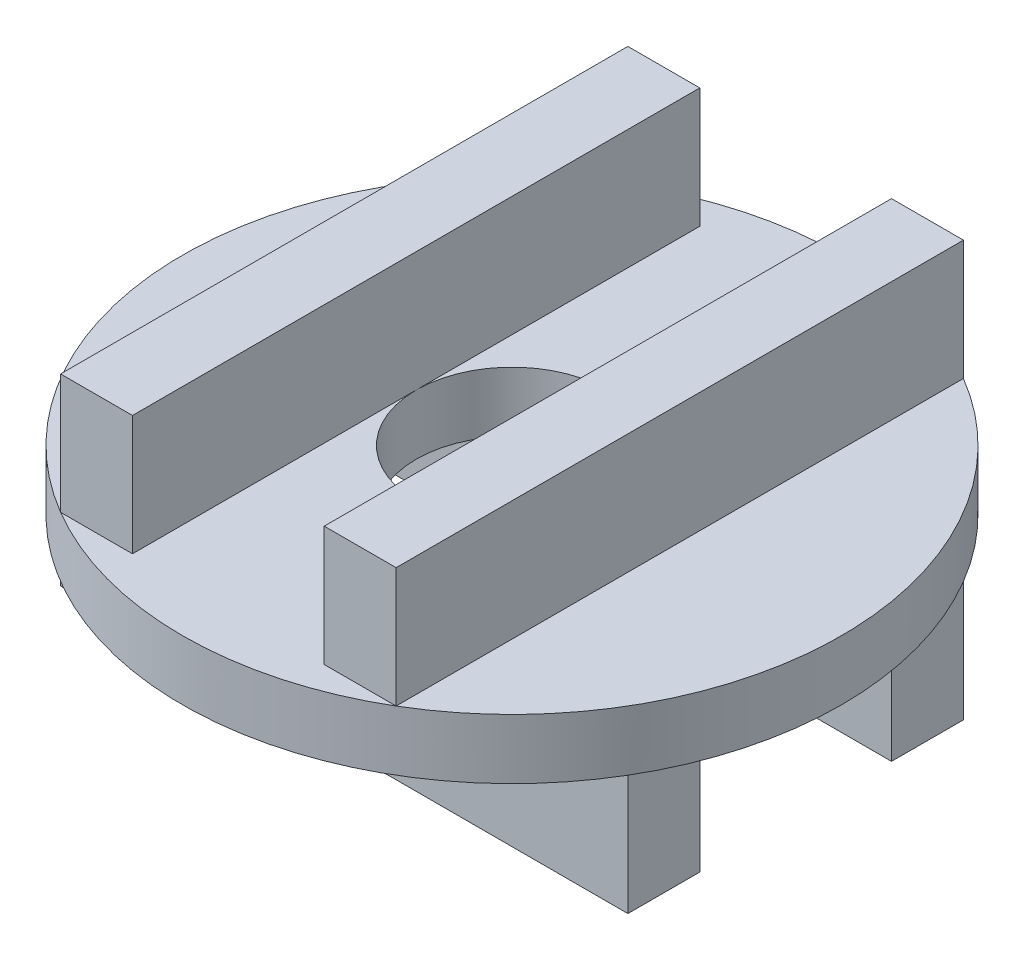
ISO-10303-21;
HEADER;
FILE_DESCRIPTION(('STEP AP214'),'2;1');
FILE_NAME('part.step','',(''),(''),'','','');
FILE_SCHEMA(('AUTOMOTIVE_DESIGN { 1 0 10303 214 1 1 1 1 }'));
ENDSEC;
DATA;
#1=APPLICATION_CONTEXT('core data for automotive mechanical design processes');
#2=APPLICATION_PROTOCOL_DEFINITION('international standard','automotive_design',2000,#1);
#3=PRODUCT_CONTEXT('',#1,'mechanical');
#4=PRODUCT('Part','Part','',(#3));
#5=PRODUCT_RELATED_PRODUCT_CATEGORY('part','',(#4));
#6=PRODUCT_DEFINITION_FORMATION('','',#4);
#7=PRODUCT_DEFINITION_CONTEXT('part definition',#1,'design');
#8=PRODUCT_DEFINITION('design','',#6,#7);
#9=PRODUCT_DEFINITION_SHAPE('','',#8);
#10=(LENGTH_UNIT() NAMED_UNIT(*) SI_UNIT(.MILLI.,.METRE.));
#11=(NAMED_UNIT(*) PLANE_ANGLE_UNIT() SI_UNIT($,.RADIAN.));
#12=(NAMED_UNIT(*) SI_UNIT($,.STERADIAN.) SOLID_ANGLE_UNIT());
#13=UNCERTAINTY_MEASURE_WITH_UNIT(LENGTH_MEASURE(1.E-05),#10,'distance_accuracy_value','');
#14=(GEOMETRIC_REPRESENTATION_CONTEXT(3) GLOBAL_UNCERTAINTY_ASSIGNED_CONTEXT((#13)) GLOBAL_UNIT_ASSIGNED_CONTEXT((#10,
#11,#12)) REPRESENTATION_CONTEXT('',''));
#15=CARTESIAN_POINT('',(0.,0.,0.));
#16=DIRECTION('',(0.,0.,1.));
#17=DIRECTION('',(1.,0.,0.));
#18=AXIS2_PLACEMENT_3D('',#15,#16,#17);
#19=CARTESIAN_POINT('',(0.,0.,0.));
#20=DIRECTION('',(0.,1.,0.));
#21=DIRECTION('',(0.,0.,1.));
#22=AXIS2_PLACEMENT_3D('',#19,#20,#21);
#23=PLANE('',#22);
#24=DIRECTION('',(0.,0.,-1.));
#25=VECTOR('',#24,1.);
#26=CARTESIAN_POINT('',(-47.3392015141785,0.,28.));
#27=LINE('',#26,#25);
#28=CARTESIAN_POINT('',(-47.3392015141785,0.,28.));
#29=VERTEX_POINT('',#28);
#30=CARTESIAN_POINT('',(-47.3392015141785,0.,16.));
#31=VERTEX_POINT('',#30);
#32=EDGE_CURVE('E193',#29,#31,#27,.T.);
#33=ORIENTED_EDGE('',*,*,#32,.F.);
#34=CARTESIAN_POINT('',(0.,0.,0.));
#35=DIRECTION('',(0.,1.,0.));
#36=DIRECTION('',(0.,0.,1.));
#37=AXIS2_PLACEMENT_3D('',#34,#35,#36);
#38=CIRCLE('',#37,55.);
#39=CARTESIAN_POINT('',(-47.3392015141785,0.,-28.));
#40=VERTEX_POINT('',#39);
#41=EDGE_CURVE('E325',#40,#29,#38,.T.);
#42=ORIENTED_EDGE('',*,*,#41,.F.);
#43=DIRECTION('',(0.,0.,-1.));
#44=VECTOR('',#43,1.);
#45=CARTESIAN_POINT('',(-47.3392015141785,0.,-28.));
#46=LINE('',#45,#44);
#47=CARTESIAN_POINT('',(-47.3392015141785,0.,-16.));
#48=VERTEX_POINT('',#47);
#49=EDGE_CURVE('E67',#48,#40,#46,.T.);
#50=ORIENTED_EDGE('',*,*,#49,.F.);
#51=DIRECTION('',(-1.,0.,0.));
#52=VECTOR('',#51,1.);
#53=CARTESIAN_POINT('',(-47.3392015141785,0.,-16.));
#54=LINE('',#53,#52);
#55=CARTESIAN_POINT('',(0.,0.,-16.));
#56=VERTEX_POINT('',#55);
#57=EDGE_CURVE('E52',#56,#48,#54,.T.);
#58=ORIENTED_EDGE('',*,*,#57,.F.);
#59=CARTESIAN_POINT('',(0.,0.,0.));
#60=DIRECTION('',(0.,1.,0.));
#61=DIRECTION('',(0.,0.,1.));
#62=AXIS2_PLACEMENT_3D('',#59,#60,#61);
#63=CIRCLE('',#62,16.);
#64=CARTESIAN_POINT('',(0.,0.,16.));
#65=VERTEX_POINT('',#64);
#66=EDGE_CURVE('E268',#56,#65,#63,.T.);
#67=ORIENTED_EDGE('',*,*,#66,.T.);
#68=DIRECTION('',(1.,0.,0.));
#69=VECTOR('',#68,1.);
#70=CARTESIAN_POINT('',(-47.3392015141785,0.,16.));
#71=LINE('',#70,#69);
#72=EDGE_CURVE('E54',#31,#65,#71,.T.);
#73=ORIENTED_EDGE('',*,*,#72,.F.);
#74=EDGE_LOOP('',(#33,#42,#50,#58,#67,#73));
#75=FACE_BOUND('',#74,.T.);
#76=ADVANCED_FACE('F43',(#75),#23,.F.);
#77=DIRECTION('',(-1.,0.,0.));
#78=VECTOR('',#77,1.);
#79=CARTESIAN_POINT('',(-47.3392015141785,0.,28.));
#80=LINE('',#79,#78);
#81=CARTESIAN_POINT('',(47.3392015141785,0.,28.));
#82=VERTEX_POINT('',#81);
#83=EDGE_CURVE('E190',#82,#29,#80,.T.);
#84=ORIENTED_EDGE('',*,*,#83,.F.);
#85=EDGE_CURVE('E302',#29,#82,#38,.T.);
#86=ORIENTED_EDGE('',*,*,#85,.F.);
#87=EDGE_LOOP('',(#84,#86));
#88=FACE_BOUND('',#87,.T.);
#89=ADVANCED_FACE('F416',(#88),#23,.F.);
#90=DIRECTION('',(0.,0.,1.));
#91=VECTOR('',#90,1.);
#92=CARTESIAN_POINT('',(47.3392015141785,0.,28.));
#93=LINE('',#92,#91);
#94=CARTESIAN_POINT('',(47.3392015141785,0.,16.));
#95=VERTEX_POINT('',#94);
#96=EDGE_CURVE('E335',#95,#82,#93,.T.);
#97=ORIENTED_EDGE('',*,*,#96,.F.);
#98=EDGE_CURVE('E11',#65,#95,#71,.T.);
#99=ORIENTED_EDGE('',*,*,#98,.F.);
#100=EDGE_CURVE('E304',#65,#56,#63,.T.);
#101=ORIENTED_EDGE('',*,*,#100,.T.);
#102=CARTESIAN_POINT('',(47.3392015141785,0.,-16.));
#103=VERTEX_POINT('',#102);
#104=EDGE_CURVE('E216',#103,#56,#54,.T.);
#105=ORIENTED_EDGE('',*,*,#104,.F.);
#106=DIRECTION('',(0.,0.,1.));
#107=VECTOR('',#106,1.);
#108=CARTESIAN_POINT('',(47.3392015141785,0.,-28.));
#109=LINE('',#108,#107);
#110=CARTESIAN_POINT('',(47.3392015141785,0.,-28.));
#111=VERTEX_POINT('',#110);
#112=EDGE_CURVE('E219',#111,#103,#109,.T.);
#113=ORIENTED_EDGE('',*,*,#112,.F.);
#114=EDGE_CURVE('E47',#82,#111,#38,.T.);
#115=ORIENTED_EDGE('',*,*,#114,.F.);
#116=EDGE_LOOP('',(#97,#99,#101,#105,#113,#115));
#117=FACE_BOUND('',#116,.T.);
#118=ADVANCED_FACE('F346',(#117),#23,.F.);
#119=DIRECTION('',(1.,0.,0.));
#120=VECTOR('',#119,1.);
#121=CARTESIAN_POINT('',(-47.3392015141785,0.,-28.));
#122=LINE('',#121,#120);
#123=EDGE_CURVE('E223',#40,#111,#122,.T.);
#124=ORIENTED_EDGE('',*,*,#123,.F.);
#125=EDGE_CURVE('E319',#111,#40,#38,.T.);
#126=ORIENTED_EDGE('',*,*,#125,.F.);
#127=EDGE_LOOP('',(#124,#126));
#128=FACE_BOUND('',#127,.T.);
#129=ADVANCED_FACE('F417',(#128),#23,.F.);
#130=CARTESIAN_POINT('',(0.,10.,0.));
#131=DIRECTION('',(0.,1.,0.));
#132=DIRECTION('',(0.,0.,1.));
#133=AXIS2_PLACEMENT_3D('',#130,#131,#132);
#134=PLANE('',#133);
#135=DIRECTION('',(1.,0.,0.));
#136=VECTOR('',#135,1.);
#137=CARTESIAN_POINT('',(28.,10.,47.3392015141785));
#138=LINE('',#137,#136);
#139=CARTESIAN_POINT('',(16.,10.,47.3392015141785));
#140=VERTEX_POINT('',#139);
#141=CARTESIAN_POINT('',(28.,10.,47.3392015141785));
#142=VERTEX_POINT('',#141);
#143=EDGE_CURVE('E238',#140,#142,#138,.T.);
#144=ORIENTED_EDGE('',*,*,#143,.F.);
#145=DIRECTION('',(0.,0.,1.));
#146=VECTOR('',#145,1.);
#147=CARTESIAN_POINT('',(16.,10.,-47.3392015141785));
#148=LINE('',#147,#146);
#149=CARTESIAN_POINT('',(16.,10.,0.));
#150=VERTEX_POINT('',#149);
#151=EDGE_CURVE('E255',#150,#140,#148,.T.);
#152=ORIENTED_EDGE('',*,*,#151,.F.);
#153=CARTESIAN_POINT('',(0.,10.,0.));
#154=DIRECTION('',(0.,1.,0.));
#155=DIRECTION('',(0.,0.,1.));
#156=AXIS2_PLACEMENT_3D('',#153,#154,#155);
#157=CIRCLE('',#156,16.);
#158=CARTESIAN_POINT('',(-16.,10.,0.));
#159=VERTEX_POINT('',#158);
#160=EDGE_CURVE('E303',#159,#150,#157,.T.);
#161=ORIENTED_EDGE('',*,*,#160,.F.);
#162=DIRECTION('',(0.,0.,-1.));
#163=VECTOR('',#162,1.);
#164=CARTESIAN_POINT('',(-16.,10.,-47.3392015141785));
#165=LINE('',#164,#163);
#166=CARTESIAN_POINT('',(-16.,10.,47.3392015141785));
#167=VERTEX_POINT('',#166);
#168=EDGE_CURVE('E282',#167,#159,#165,.T.);
#169=ORIENTED_EDGE('',*,*,#168,.F.);
#170=DIRECTION('',(1.,0.,0.));
#171=VECTOR('',#170,1.);
#172=CARTESIAN_POINT('',(-28.,10.,47.3392015141785));
#173=LINE('',#172,#171);
#174=CARTESIAN_POINT('',(-28.,10.,47.3392015141785));
#175=VERTEX_POINT('',#174);
#176=EDGE_CURVE('E286',#175,#167,#173,.T.);
#177=ORIENTED_EDGE('',*,*,#176,.F.);
#178=CARTESIAN_POINT('',(0.,10.,0.));
#179=DIRECTION('',(0.,1.,0.));
#180=DIRECTION('',(0.,0.,1.));
#181=AXIS2_PLACEMENT_3D('',#178,#179,#180);
#182=CIRCLE('',#181,55.);
#183=EDGE_CURVE('E309',#175,#142,#182,.T.);
#184=ORIENTED_EDGE('',*,*,#183,.T.);
#185=EDGE_LOOP('',(#144,#152,#161,#169,#177,#184));
#186=FACE_BOUND('',#185,.T.);
#187=ADVANCED_FACE('F408',(#186),#134,.T.);
#188=DIRECTION('',(0.,0.,-1.));
#189=VECTOR('',#188,1.);
#190=CARTESIAN_POINT('',(28.,10.,-47.3392015141785));
#191=LINE('',#190,#189);
#192=CARTESIAN_POINT('',(28.,10.,-47.3392015141785));
#193=VERTEX_POINT('',#192);
#194=EDGE_CURVE('E245',#142,#193,#191,.T.);
#195=ORIENTED_EDGE('',*,*,#194,.F.);
#196=EDGE_CURVE('E306',#142,#193,#182,.T.);
#197=ORIENTED_EDGE('',*,*,#196,.T.);
#198=EDGE_LOOP('',(#195,#197));
#199=FACE_BOUND('',#198,.T.);
#200=ADVANCED_FACE('F429',(#199),#134,.T.);
#201=CARTESIAN_POINT('',(16.,10.,-47.3392015141785));
#202=VERTEX_POINT('',#201);
#203=EDGE_CURVE('E252',#202,#150,#148,.T.);
#204=ORIENTED_EDGE('',*,*,#203,.F.);
#205=DIRECTION('',(-1.,0.,0.));
#206=VECTOR('',#205,1.);
#207=CARTESIAN_POINT('',(28.,10.,-47.3392015141785));
#208=LINE('',#207,#206);
#209=EDGE_CURVE('E248',#193,#202,#208,.T.);
#210=ORIENTED_EDGE('',*,*,#209,.F.);
#211=CARTESIAN_POINT('',(-28.,10.,-47.3392015141785));
#212=VERTEX_POINT('',#211);
#213=EDGE_CURVE('E308',#193,#212,#182,.T.);
#214=ORIENTED_EDGE('',*,*,#213,.T.);
#215=DIRECTION('',(-1.,0.,0.));
#216=VECTOR('',#215,1.);
#217=CARTESIAN_POINT('',(-28.,10.,-47.3392015141785));
#218=LINE('',#217,#216);
#219=CARTESIAN_POINT('',(-16.,10.,-47.3392015141785));
#220=VERTEX_POINT('',#219);
#221=EDGE_CURVE('E279',#220,#212,#218,.T.);
#222=ORIENTED_EDGE('',*,*,#221,.F.);
#223=EDGE_CURVE('E287',#159,#220,#165,.T.);
#224=ORIENTED_EDGE('',*,*,#223,.F.);
#225=EDGE_CURVE('E299',#150,#159,#157,.T.);
#226=ORIENTED_EDGE('',*,*,#225,.F.);
#227=EDGE_LOOP('',(#204,#210,#214,#222,#224,#226));
#228=FACE_BOUND('',#227,.T.);
#229=ADVANCED_FACE('F387',(#228),#134,.T.);
#230=DIRECTION('',(0.,0.,1.));
#231=VECTOR('',#230,1.);
#232=CARTESIAN_POINT('',(-28.,10.,-47.3392015141785));
#233=LINE('',#232,#231);
#234=EDGE_CURVE('E249',#212,#175,#233,.T.);
#235=ORIENTED_EDGE('',*,*,#234,.F.);
#236=EDGE_CURVE('E314',#212,#175,#182,.T.);
#237=ORIENTED_EDGE('',*,*,#236,.T.);
#238=EDGE_LOOP('',(#235,#237));
#239=FACE_BOUND('',#238,.T.);
#240=ADVANCED_FACE('F392',(#239),#134,.T.);
#241=CARTESIAN_POINT('',(0.,10.,0.));
#242=DIRECTION('',(0.,-1.,0.));
#243=DIRECTION('',(0.,0.,-1.));
#244=AXIS2_PLACEMENT_3D('',#241,#242,#243);
#245=CYLINDRICAL_SURFACE('',#244,55.);
#246=ORIENTED_EDGE('',*,*,#196,.F.);
#247=ORIENTED_EDGE('',*,*,#183,.F.);
#248=ORIENTED_EDGE('',*,*,#236,.F.);
#249=ORIENTED_EDGE('',*,*,#213,.F.);
#250=EDGE_LOOP('',(#246,#247,#248,#249));
#251=FACE_BOUND('',#250,.T.);
#252=ORIENTED_EDGE('',*,*,#114,.T.);
#253=ORIENTED_EDGE('',*,*,#125,.T.);
#254=ORIENTED_EDGE('',*,*,#41,.T.);
#255=ORIENTED_EDGE('',*,*,#85,.T.);
#256=EDGE_LOOP('',(#252,#253,#254,#255));
#257=FACE_BOUND('',#256,.T.);
#258=ADVANCED_FACE('F45',(#251,#257),#245,.T.);
#259=CARTESIAN_POINT('',(0.,10.,0.));
#260=DIRECTION('',(0.,-1.,0.));
#261=DIRECTION('',(0.,0.,-1.));
#262=AXIS2_PLACEMENT_3D('',#259,#260,#261);
#263=CYLINDRICAL_SURFACE('',#262,16.);
#264=ORIENTED_EDGE('',*,*,#225,.T.);
#265=ORIENTED_EDGE('',*,*,#160,.T.);
#266=EDGE_LOOP('',(#264,#265));
#267=FACE_BOUND('',#266,.T.);
#268=ORIENTED_EDGE('',*,*,#100,.F.);
#269=ORIENTED_EDGE('',*,*,#66,.F.);
#270=EDGE_LOOP('',(#268,#269));
#271=FACE_BOUND('',#270,.T.);
#272=ADVANCED_FACE('F410',(#267,#271),#263,.F.);
#273=CARTESIAN_POINT('',(-28.,30.,-47.3392015141785));
#274=DIRECTION('',(1.,0.,0.));
#275=DIRECTION('',(0.,0.,-1.));
#276=AXIS2_PLACEMENT_3D('',#273,#274,#275);
#277=PLANE('',#276);
#278=ORIENTED_EDGE('',*,*,#234,.T.);
#279=DIRECTION('',(0.,-1.,0.));
#280=VECTOR('',#279,1.);
#281=CARTESIAN_POINT('',(-28.,30.,47.3392015141785));
#282=LINE('',#281,#280);
#283=CARTESIAN_POINT('',(-28.,30.,47.3392015141785));
#284=VERTEX_POINT('',#283);
#285=EDGE_CURVE('E194',#284,#175,#282,.T.);
#286=ORIENTED_EDGE('',*,*,#285,.F.);
#287=DIRECTION('',(0.,0.,1.));
#288=VECTOR('',#287,1.);
#289=CARTESIAN_POINT('',(-28.,30.,-47.3392015141785));
#290=LINE('',#289,#288);
#291=CARTESIAN_POINT('',(-28.,30.,-47.3392015141785));
#292=VERTEX_POINT('',#291);
#293=EDGE_CURVE('E283',#292,#284,#290,.T.);
#294=ORIENTED_EDGE('',*,*,#293,.F.);
#295=DIRECTION('',(0.,-1.,0.));
#296=VECTOR('',#295,1.);
#297=CARTESIAN_POINT('',(-28.,30.,-47.3392015141785));
#298=LINE('',#297,#296);
#299=EDGE_CURVE('E275',#292,#212,#298,.T.);
#300=ORIENTED_EDGE('',*,*,#299,.T.);
#301=EDGE_LOOP('',(#278,#286,#294,#300));
#302=FACE_BOUND('',#301,.T.);
#303=ADVANCED_FACE('F399',(#302),#277,.F.);
#304=CARTESIAN_POINT('',(-28.,30.,47.3392015141785));
#305=DIRECTION('',(0.,0.,-1.));
#306=DIRECTION('',(-1.,0.,0.));
#307=AXIS2_PLACEMENT_3D('',#304,#305,#306);
#308=PLANE('',#307);
#309=ORIENTED_EDGE('',*,*,#176,.T.);
#310=DIRECTION('',(0.,-1.,0.));
#311=VECTOR('',#310,1.);
#312=CARTESIAN_POINT('',(-16.,30.,47.3392015141785));
#313=LINE('',#312,#311);
#314=CARTESIAN_POINT('',(-16.,30.,47.3392015141785));
#315=VERTEX_POINT('',#314);
#316=EDGE_CURVE('E197',#315,#167,#313,.T.);
#317=ORIENTED_EDGE('',*,*,#316,.F.);
#318=DIRECTION('',(1.,0.,0.));
#319=VECTOR('',#318,1.);
#320=CARTESIAN_POINT('',(-28.,30.,47.3392015141785));
#321=LINE('',#320,#319);
#322=EDGE_CURVE('E295',#284,#315,#321,.T.);
#323=ORIENTED_EDGE('',*,*,#322,.F.);
#324=ORIENTED_EDGE('',*,*,#285,.T.);
#325=EDGE_LOOP('',(#309,#317,#323,#324));
#326=FACE_BOUND('',#325,.T.);
#327=ADVANCED_FACE('F395',(#326),#308,.F.);
#328=CARTESIAN_POINT('',(-16.,30.,-47.3392015141785));
#329=DIRECTION('',(-1.,0.,0.));
#330=DIRECTION('',(0.,0.,1.));
#331=AXIS2_PLACEMENT_3D('',#328,#329,#330);
#332=PLANE('',#331);
#333=ORIENTED_EDGE('',*,*,#168,.T.);
#334=ORIENTED_EDGE('',*,*,#223,.T.);
#335=DIRECTION('',(0.,-1.,0.));
#336=VECTOR('',#335,1.);
#337=CARTESIAN_POINT('',(-16.,30.,-47.3392015141785));
#338=LINE('',#337,#336);
#339=CARTESIAN_POINT('',(-16.,30.,-47.3392015141785));
#340=VERTEX_POINT('',#339);
#341=EDGE_CURVE('E272',#340,#220,#338,.T.);
#342=ORIENTED_EDGE('',*,*,#341,.F.);
#343=DIRECTION('',(0.,0.,-1.));
#344=VECTOR('',#343,1.);
#345=CARTESIAN_POINT('',(-16.,30.,-47.3392015141785));
#346=LINE('',#345,#344);
#347=EDGE_CURVE('E293',#315,#340,#346,.T.);
#348=ORIENTED_EDGE('',*,*,#347,.F.);
#349=ORIENTED_EDGE('',*,*,#316,.T.);
#350=EDGE_LOOP('',(#333,#334,#342,#348,#349));
#351=FACE_BOUND('',#350,.T.);
#352=ADVANCED_FACE('F406',(#351),#332,.F.);
#353=CARTESIAN_POINT('',(-28.,30.,-47.3392015141785));
#354=DIRECTION('',(0.,0.,1.));
#355=DIRECTION('',(1.,0.,0.));
#356=AXIS2_PLACEMENT_3D('',#353,#354,#355);
#357=PLANE('',#356);
#358=ORIENTED_EDGE('',*,*,#221,.T.);
#359=ORIENTED_EDGE('',*,*,#299,.F.);
#360=DIRECTION('',(-1.,0.,0.));
#361=VECTOR('',#360,1.);
#362=CARTESIAN_POINT('',(-28.,30.,-47.3392015141785));
#363=LINE('',#362,#361);
#364=EDGE_CURVE('E278',#340,#292,#363,.T.);
#365=ORIENTED_EDGE('',*,*,#364,.F.);
#366=ORIENTED_EDGE('',*,*,#341,.T.);
#367=EDGE_LOOP('',(#358,#359,#365,#366));
#368=FACE_BOUND('',#367,.T.);
#369=ADVANCED_FACE('F403',(#368),#357,.F.);
#370=CARTESIAN_POINT('',(0.,30.,0.));
#371=DIRECTION('',(0.,1.,0.));
#372=DIRECTION('',(0.,0.,1.));
#373=AXIS2_PLACEMENT_3D('',#370,#371,#372);
#374=PLANE('',#373);
#375=ORIENTED_EDGE('',*,*,#293,.T.);
#376=ORIENTED_EDGE('',*,*,#322,.T.);
#377=ORIENTED_EDGE('',*,*,#347,.T.);
#378=ORIENTED_EDGE('',*,*,#364,.T.);
#379=EDGE_LOOP('',(#375,#376,#377,#378));
#380=FACE_BOUND('',#379,.T.);
#381=ADVANCED_FACE('F537',(#380),#374,.T.);
#382=CARTESIAN_POINT('',(28.,30.,-47.3392015141785));
#383=DIRECTION('',(-1.,0.,0.));
#384=DIRECTION('',(0.,0.,1.));
#385=AXIS2_PLACEMENT_3D('',#382,#383,#384);
#386=PLANE('',#385);
#387=ORIENTED_EDGE('',*,*,#194,.T.);
#388=DIRECTION('',(0.,-1.,0.));
#389=VECTOR('',#388,1.);
#390=CARTESIAN_POINT('',(28.,30.,-47.3392015141785));
#391=LINE('',#390,#389);
#392=CARTESIAN_POINT('',(28.,30.,-47.3392015141785));
#393=VERTEX_POINT('',#392);
#394=EDGE_CURVE('E266',#393,#193,#391,.T.);
#395=ORIENTED_EDGE('',*,*,#394,.F.);
#396=DIRECTION('',(0.,0.,-1.));
#397=VECTOR('',#396,1.);
#398=CARTESIAN_POINT('',(28.,30.,-47.3392015141785));
#399=LINE('',#398,#397);
#400=CARTESIAN_POINT('',(28.,30.,47.3392015141785));
#401=VERTEX_POINT('',#400);
#402=EDGE_CURVE('E234',#401,#393,#399,.T.);
#403=ORIENTED_EDGE('',*,*,#402,.F.);
#404=DIRECTION('',(0.,-1.,0.));
#405=VECTOR('',#404,1.);
#406=CARTESIAN_POINT('',(28.,30.,47.3392015141785));
#407=LINE('',#406,#405);
#408=EDGE_CURVE('E244',#401,#142,#407,.T.);
#409=ORIENTED_EDGE('',*,*,#408,.T.);
#410=EDGE_LOOP('',(#387,#395,#403,#409));
#411=FACE_BOUND('',#410,.T.);
#412=ADVANCED_FACE('F534',(#411),#386,.F.);
#413=CARTESIAN_POINT('',(28.,30.,-47.3392015141785));
#414=DIRECTION('',(0.,0.,1.));
#415=DIRECTION('',(1.,0.,0.));
#416=AXIS2_PLACEMENT_3D('',#413,#414,#415);
#417=PLANE('',#416);
#418=ORIENTED_EDGE('',*,*,#209,.T.);
#419=DIRECTION('',(0.,-1.,0.));
#420=VECTOR('',#419,1.);
#421=CARTESIAN_POINT('',(16.,30.,-47.3392015141785));
#422=LINE('',#421,#420);
#423=CARTESIAN_POINT('',(16.,30.,-47.3392015141785));
#424=VERTEX_POINT('',#423);
#425=EDGE_CURVE('E263',#424,#202,#422,.T.);
#426=ORIENTED_EDGE('',*,*,#425,.F.);
#427=DIRECTION('',(-1.,0.,0.));
#428=VECTOR('',#427,1.);
#429=CARTESIAN_POINT('',(28.,30.,-47.3392015141785));
#430=LINE('',#429,#428);
#431=EDGE_CURVE('E237',#393,#424,#430,.T.);
#432=ORIENTED_EDGE('',*,*,#431,.F.);
#433=ORIENTED_EDGE('',*,*,#394,.T.);
#434=EDGE_LOOP('',(#418,#426,#432,#433));
#435=FACE_BOUND('',#434,.T.);
#436=ADVANCED_FACE('F384',(#435),#417,.F.);
#437=CARTESIAN_POINT('',(16.,30.,-47.3392015141785));
#438=DIRECTION('',(1.,0.,0.));
#439=DIRECTION('',(0.,0.,-1.));
#440=AXIS2_PLACEMENT_3D('',#437,#438,#439);
#441=PLANE('',#440);
#442=ORIENTED_EDGE('',*,*,#203,.T.);
#443=ORIENTED_EDGE('',*,*,#151,.T.);
#444=DIRECTION('',(0.,-1.,0.));
#445=VECTOR('',#444,1.);
#446=CARTESIAN_POINT('',(16.,30.,47.3392015141785));
#447=LINE('',#446,#445);
#448=CARTESIAN_POINT('',(16.,30.,47.3392015141785));
#449=VERTEX_POINT('',#448);
#450=EDGE_CURVE('E260',#449,#140,#447,.T.);
#451=ORIENTED_EDGE('',*,*,#450,.F.);
#452=DIRECTION('',(0.,0.,1.));
#453=VECTOR('',#452,1.);
#454=CARTESIAN_POINT('',(16.,30.,-47.3392015141785));
#455=LINE('',#454,#453);
#456=EDGE_CURVE('E240',#424,#449,#455,.T.);
#457=ORIENTED_EDGE('',*,*,#456,.F.);
#458=ORIENTED_EDGE('',*,*,#425,.T.);
#459=EDGE_LOOP('',(#442,#443,#451,#457,#458));
#460=FACE_BOUND('',#459,.T.);
#461=ADVANCED_FACE('F370',(#460),#441,.F.);
#462=CARTESIAN_POINT('',(28.,30.,47.3392015141785));
#463=DIRECTION('',(0.,0.,-1.));
#464=DIRECTION('',(-1.,0.,0.));
#465=AXIS2_PLACEMENT_3D('',#462,#463,#464);
#466=PLANE('',#465);
#467=ORIENTED_EDGE('',*,*,#143,.T.);
#468=ORIENTED_EDGE('',*,*,#408,.F.);
#469=DIRECTION('',(1.,0.,0.));
#470=VECTOR('',#469,1.);
#471=CARTESIAN_POINT('',(28.,30.,47.3392015141785));
#472=LINE('',#471,#470);
#473=EDGE_CURVE('E242',#449,#401,#472,.T.);
#474=ORIENTED_EDGE('',*,*,#473,.F.);
#475=ORIENTED_EDGE('',*,*,#450,.T.);
#476=EDGE_LOOP('',(#467,#468,#474,#475));
#477=FACE_BOUND('',#476,.T.);
#478=ADVANCED_FACE('F376',(#477),#466,.F.);
#479=CARTESIAN_POINT('',(0.,30.,0.));
#480=DIRECTION('',(0.,-1.,0.));
#481=DIRECTION('',(0.,0.,-1.));
#482=AXIS2_PLACEMENT_3D('',#479,#480,#481);
#483=PLANE('',#482);
#484=ORIENTED_EDGE('',*,*,#402,.T.);
#485=ORIENTED_EDGE('',*,*,#431,.T.);
#486=ORIENTED_EDGE('',*,*,#456,.T.);
#487=ORIENTED_EDGE('',*,*,#473,.T.);
#488=EDGE_LOOP('',(#484,#485,#486,#487));
#489=FACE_BOUND('',#488,.T.);
#490=ADVANCED_FACE('F380',(#489),#483,.F.);
#491=CARTESIAN_POINT('',(-47.3392015141785,-20.,-28.));
#492=DIRECTION('',(1.,0.,0.));
#493=DIRECTION('',(0.,0.,-1.));
#494=AXIS2_PLACEMENT_3D('',#491,#492,#493);
#495=PLANE('',#494);
#496=ORIENTED_EDGE('',*,*,#49,.T.);
#497=DIRECTION('',(0.,1.,0.));
#498=VECTOR('',#497,1.);
#499=CARTESIAN_POINT('',(-47.3392015141785,-20.,-28.));
#500=LINE('',#499,#498);
#501=CARTESIAN_POINT('',(-47.3392015141785,-20.,-28.));
#502=VERTEX_POINT('',#501);
#503=EDGE_CURVE('E203',#502,#40,#500,.T.);
#504=ORIENTED_EDGE('',*,*,#503,.F.);
#505=DIRECTION('',(0.,0.,-1.));
#506=VECTOR('',#505,1.);
#507=CARTESIAN_POINT('',(-47.3392015141785,-20.,-28.));
#508=LINE('',#507,#506);
#509=CARTESIAN_POINT('',(-47.3392015141785,-20.,-16.));
#510=VERTEX_POINT('',#509);
#511=EDGE_CURVE('E220',#510,#502,#508,.T.);
#512=ORIENTED_EDGE('',*,*,#511,.F.);
#513=DIRECTION('',(0.,1.,0.));
#514=VECTOR('',#513,1.);
#515=CARTESIAN_POINT('',(-47.3392015141785,-20.,-16.));
#516=LINE('',#515,#514);
#517=EDGE_CURVE('E212',#510,#48,#516,.T.);
#518=ORIENTED_EDGE('',*,*,#517,.T.);
#519=EDGE_LOOP('',(#496,#504,#512,#518));
#520=FACE_BOUND('',#519,.T.);
#521=ADVANCED_FACE('F363',(#520),#495,.F.);
#522=CARTESIAN_POINT('',(-47.3392015141785,-20.,-28.));
#523=DIRECTION('',(0.,0.,1.));
#524=DIRECTION('',(1.,0.,0.));
#525=AXIS2_PLACEMENT_3D('',#522,#523,#524);
#526=PLANE('',#525);
#527=ORIENTED_EDGE('',*,*,#123,.T.);
#528=DIRECTION('',(0.,1.,0.));
#529=VECTOR('',#528,1.);
#530=CARTESIAN_POINT('',(47.3392015141785,-20.,-28.));
#531=LINE('',#530,#529);
#532=CARTESIAN_POINT('',(47.3392015141785,-20.,-28.));
#533=VERTEX_POINT('',#532);
#534=EDGE_CURVE('E206',#533,#111,#531,.T.);
#535=ORIENTED_EDGE('',*,*,#534,.F.);
#536=DIRECTION('',(1.,0.,0.));
#537=VECTOR('',#536,1.);
#538=CARTESIAN_POINT('',(-47.3392015141785,-20.,-28.));
#539=LINE('',#538,#537);
#540=EDGE_CURVE('E230',#502,#533,#539,.T.);
#541=ORIENTED_EDGE('',*,*,#540,.F.);
#542=ORIENTED_EDGE('',*,*,#503,.T.);
#543=EDGE_LOOP('',(#527,#535,#541,#542));
#544=FACE_BOUND('',#543,.T.);
#545=ADVANCED_FACE('F352',(#544),#526,.F.);
#546=CARTESIAN_POINT('',(47.3392015141785,-20.,-28.));
#547=DIRECTION('',(-1.,0.,0.));
#548=DIRECTION('',(0.,0.,1.));
#549=AXIS2_PLACEMENT_3D('',#546,#547,#548);
#550=PLANE('',#549);
#551=ORIENTED_EDGE('',*,*,#112,.T.);
#552=DIRECTION('',(0.,1.,0.));
#553=VECTOR('',#552,1.);
#554=CARTESIAN_POINT('',(47.3392015141785,-20.,-16.));
#555=LINE('',#554,#553);
#556=CARTESIAN_POINT('',(47.3392015141785,-20.,-16.));
#557=VERTEX_POINT('',#556);
#558=EDGE_CURVE('E209',#557,#103,#555,.T.);
#559=ORIENTED_EDGE('',*,*,#558,.F.);
#560=DIRECTION('',(0.,0.,1.));
#561=VECTOR('',#560,1.);
#562=CARTESIAN_POINT('',(47.3392015141785,-20.,-28.));
#563=LINE('',#562,#561);
#564=EDGE_CURVE('E228',#533,#557,#563,.T.);
#565=ORIENTED_EDGE('',*,*,#564,.F.);
#566=ORIENTED_EDGE('',*,*,#534,.T.);
#567=EDGE_LOOP('',(#551,#559,#565,#566));
#568=FACE_BOUND('',#567,.T.);
#569=ADVANCED_FACE('F356',(#568),#550,.F.);
#570=CARTESIAN_POINT('',(-47.3392015141785,-20.,-16.));
#571=DIRECTION('',(0.,0.,-1.));
#572=DIRECTION('',(-1.,0.,0.));
#573=AXIS2_PLACEMENT_3D('',#570,#571,#572);
#574=PLANE('',#573);
#575=ORIENTED_EDGE('',*,*,#104,.T.);
#576=ORIENTED_EDGE('',*,*,#57,.T.);
#577=ORIENTED_EDGE('',*,*,#517,.F.);
#578=DIRECTION('',(-1.,0.,0.));
#579=VECTOR('',#578,1.);
#580=CARTESIAN_POINT('',(-47.3392015141785,-20.,-16.));
#581=LINE('',#580,#579);
#582=EDGE_CURVE('E215',#557,#510,#581,.T.);
#583=ORIENTED_EDGE('',*,*,#582,.F.);
#584=ORIENTED_EDGE('',*,*,#558,.T.);
#585=EDGE_LOOP('',(#575,#576,#577,#583,#584));
#586=FACE_BOUND('',#585,.T.);
#587=ADVANCED_FACE('F365',(#586),#574,.F.);
#588=CARTESIAN_POINT('',(0.,-20.,0.));
#589=DIRECTION('',(0.,1.,0.));
#590=DIRECTION('',(0.,0.,1.));
#591=AXIS2_PLACEMENT_3D('',#588,#589,#590);
#592=PLANE('',#591);
#593=ORIENTED_EDGE('',*,*,#511,.T.);
#594=ORIENTED_EDGE('',*,*,#540,.T.);
#595=ORIENTED_EDGE('',*,*,#564,.T.);
#596=ORIENTED_EDGE('',*,*,#582,.T.);
#597=EDGE_LOOP('',(#593,#594,#595,#596));
#598=FACE_BOUND('',#597,.T.);
#599=ADVANCED_FACE('F359',(#598),#592,.F.);
#600=CARTESIAN_POINT('',(-47.3392015141785,-20.,28.));
#601=DIRECTION('',(1.,0.,0.));
#602=DIRECTION('',(0.,0.,-1.));
#603=AXIS2_PLACEMENT_3D('',#600,#601,#602);
#604=PLANE('',#603);
#605=ORIENTED_EDGE('',*,*,#32,.T.);
#606=DIRECTION('',(0.,1.,0.));
#607=VECTOR('',#606,1.);
#608=CARTESIAN_POINT('',(-47.3392015141785,-20.,16.));
#609=LINE('',#608,#607);
#610=CARTESIAN_POINT('',(-47.3392015141785,-20.,16.));
#611=VERTEX_POINT('',#610);
#612=EDGE_CURVE('E174',#611,#31,#609,.T.);
#613=ORIENTED_EDGE('',*,*,#612,.F.);
#614=DIRECTION('',(0.,0.,-1.));
#615=VECTOR('',#614,1.);
#616=CARTESIAN_POINT('',(-47.3392015141785,-20.,28.));
#617=LINE('',#616,#615);
#618=CARTESIAN_POINT('',(-47.3392015141785,-20.,28.));
#619=VERTEX_POINT('',#618);
#620=EDGE_CURVE('E181',#619,#611,#617,.T.);
#621=ORIENTED_EDGE('',*,*,#620,.F.);
#622=DIRECTION('',(0.,1.,0.));
#623=VECTOR('',#622,1.);
#624=CARTESIAN_POINT('',(-47.3392015141785,-20.,28.));
#625=LINE('',#624,#623);
#626=EDGE_CURVE('E332',#619,#29,#625,.T.);
#627=ORIENTED_EDGE('',*,*,#626,.T.);
#628=EDGE_LOOP('',(#605,#613,#621,#627));
#629=FACE_BOUND('',#628,.T.);
#630=ADVANCED_FACE('F192',(#629),#604,.F.);
#631=CARTESIAN_POINT('',(-47.3392015141785,-20.,16.));
#632=DIRECTION('',(0.,0.,1.));
#633=DIRECTION('',(1.,0.,0.));
#634=AXIS2_PLACEMENT_3D('',#631,#632,#633);
#635=PLANE('',#634);
#636=ORIENTED_EDGE('',*,*,#72,.T.);
#637=ORIENTED_EDGE('',*,*,#98,.T.);
#638=DIRECTION('',(0.,1.,0.));
#639=VECTOR('',#638,1.);
#640=CARTESIAN_POINT('',(47.3392015141785,-20.,16.));
#641=LINE('',#640,#639);
#642=CARTESIAN_POINT('',(47.3392015141785,-20.,16.));
#643=VERTEX_POINT('',#642);
#644=EDGE_CURVE('E177',#643,#95,#641,.T.);
#645=ORIENTED_EDGE('',*,*,#644,.F.);
#646=DIRECTION('',(1.,0.,0.));
#647=VECTOR('',#646,1.);
#648=CARTESIAN_POINT('',(-47.3392015141785,-20.,16.));
#649=LINE('',#648,#647);
#650=EDGE_CURVE('E170',#611,#643,#649,.T.);
#651=ORIENTED_EDGE('',*,*,#650,.F.);
#652=ORIENTED_EDGE('',*,*,#612,.T.);
#653=EDGE_LOOP('',(#636,#637,#645,#651,#652));
#654=FACE_BOUND('',#653,.T.);
#655=ADVANCED_FACE('F172',(#654),#635,.F.);
#656=CARTESIAN_POINT('',(47.3392015141785,-20.,28.));
#657=DIRECTION('',(-1.,0.,0.));
#658=DIRECTION('',(0.,0.,1.));
#659=AXIS2_PLACEMENT_3D('',#656,#657,#658);
#660=PLANE('',#659);
#661=ORIENTED_EDGE('',*,*,#96,.T.);
#662=DIRECTION('',(0.,1.,0.));
#663=VECTOR('',#662,1.);
#664=CARTESIAN_POINT('',(47.3392015141785,-20.,28.));
#665=LINE('',#664,#663);
#666=CARTESIAN_POINT('',(47.3392015141785,-20.,28.));
#667=VERTEX_POINT('',#666);
#668=EDGE_CURVE('E199',#667,#82,#665,.T.);
#669=ORIENTED_EDGE('',*,*,#668,.F.);
#670=DIRECTION('',(0.,0.,1.));
#671=VECTOR('',#670,1.);
#672=CARTESIAN_POINT('',(47.3392015141785,-20.,28.));
#673=LINE('',#672,#671);
#674=EDGE_CURVE('E180',#643,#667,#673,.T.);
#675=ORIENTED_EDGE('',*,*,#674,.F.);
#676=ORIENTED_EDGE('',*,*,#644,.T.);
#677=EDGE_LOOP('',(#661,#669,#675,#676));
#678=FACE_BOUND('',#677,.T.);
#679=ADVANCED_FACE('F344',(#678),#660,.F.);
#680=CARTESIAN_POINT('',(-47.3392015141785,-20.,28.));
#681=DIRECTION('',(0.,0.,-1.));
#682=DIRECTION('',(-1.,0.,0.));
#683=AXIS2_PLACEMENT_3D('',#680,#681,#682);
#684=PLANE('',#683);
#685=ORIENTED_EDGE('',*,*,#83,.T.);
#686=ORIENTED_EDGE('',*,*,#626,.F.);
#687=DIRECTION('',(-1.,0.,0.));
#688=VECTOR('',#687,1.);
#689=CARTESIAN_POINT('',(-47.3392015141785,-20.,28.));
#690=LINE('',#689,#688);
#691=EDGE_CURVE('E186',#667,#619,#690,.T.);
#692=ORIENTED_EDGE('',*,*,#691,.F.);
#693=ORIENTED_EDGE('',*,*,#668,.T.);
#694=EDGE_LOOP('',(#685,#686,#692,#693));
#695=FACE_BOUND('',#694,.T.);
#696=ADVANCED_FACE('F331',(#695),#684,.F.);
#697=CARTESIAN_POINT('',(0.,-20.,0.));
#698=DIRECTION('',(0.,-1.,0.));
#699=DIRECTION('',(0.,0.,-1.));
#700=AXIS2_PLACEMENT_3D('',#697,#698,#699);
#701=PLANE('',#700);
#702=ORIENTED_EDGE('',*,*,#620,.T.);
#703=ORIENTED_EDGE('',*,*,#650,.T.);
#704=ORIENTED_EDGE('',*,*,#674,.T.);
#705=ORIENTED_EDGE('',*,*,#691,.T.);
#706=EDGE_LOOP('',(#702,#703,#704,#705));
#707=FACE_BOUND('',#706,.T.);
#708=ADVANCED_FACE('F184',(#707),#701,.T.);
#709=CLOSED_SHELL('',(#76,#89,#118,#129,#187,#200,#229,#240,#258,#272,#303,#327,#352,#369,#381,
#412,#436,#461,#478,#490,#521,#545,#569,#587,#599,#630,#655,#679,#696,#708));
#710=MANIFOLD_SOLID_BREP('B2',#709);
#711=ADVANCED_BREP_SHAPE_REPRESENTATION('',(#18,#710),#14);
#712=SHAPE_DEFINITION_REPRESENTATION(#9,#711);
ENDSEC;
END-ISO-10303-21;
